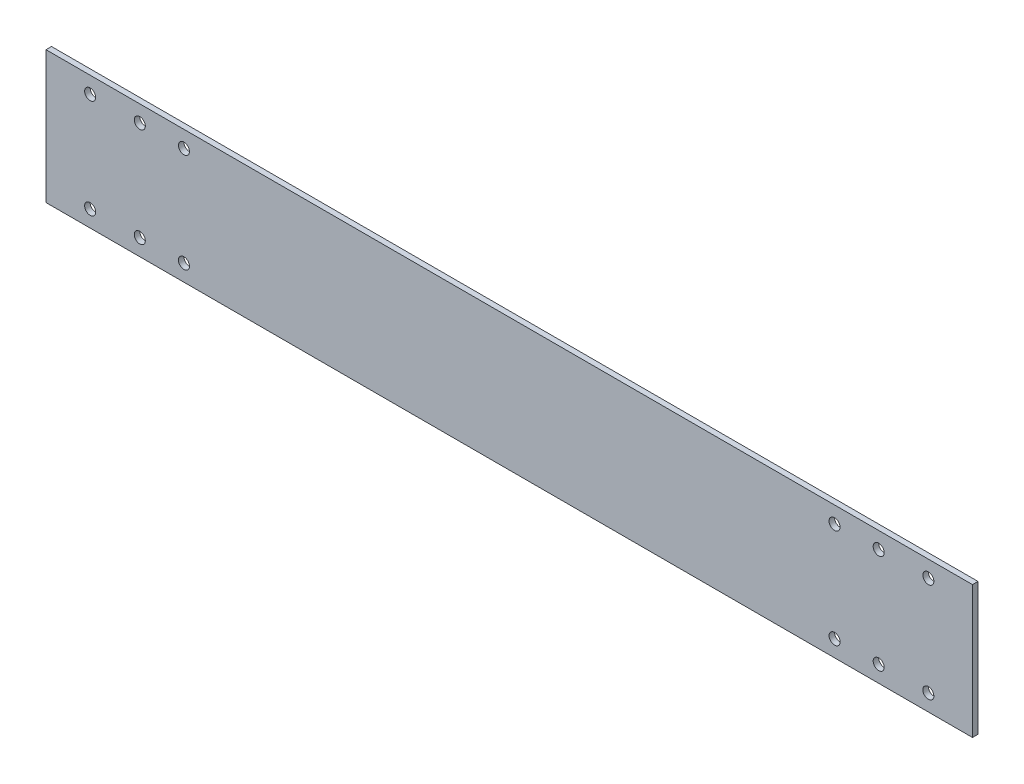
ISO-10303-21;
HEADER;
FILE_DESCRIPTION(('STEP AP214'),'2;1');
FILE_NAME('part.step','',(''),(''),'','','');
FILE_SCHEMA(('AUTOMOTIVE_DESIGN { 1 0 10303 214 1 1 1 1 }'));
ENDSEC;
DATA;
#1=APPLICATION_CONTEXT('core data for automotive mechanical design processes');
#2=APPLICATION_PROTOCOL_DEFINITION('international standard','automotive_design',2000,#1);
#3=PRODUCT_CONTEXT('',#1,'mechanical');
#4=PRODUCT('Part','Part','',(#3));
#5=PRODUCT_RELATED_PRODUCT_CATEGORY('part','',(#4));
#6=PRODUCT_DEFINITION_FORMATION('','',#4);
#7=PRODUCT_DEFINITION_CONTEXT('part definition',#1,'design');
#8=PRODUCT_DEFINITION('design','',#6,#7);
#9=PRODUCT_DEFINITION_SHAPE('','',#8);
#10=(LENGTH_UNIT() NAMED_UNIT(*) SI_UNIT(.MILLI.,.METRE.));
#11=(NAMED_UNIT(*) PLANE_ANGLE_UNIT() SI_UNIT($,.RADIAN.));
#12=(NAMED_UNIT(*) SI_UNIT($,.STERADIAN.) SOLID_ANGLE_UNIT());
#13=UNCERTAINTY_MEASURE_WITH_UNIT(LENGTH_MEASURE(1.E-05),#10,'distance_accuracy_value','');
#14=(GEOMETRIC_REPRESENTATION_CONTEXT(3) GLOBAL_UNCERTAINTY_ASSIGNED_CONTEXT((#13)) GLOBAL_UNIT_ASSIGNED_CONTEXT((#10,
#11,#12)) REPRESENTATION_CONTEXT('',''));
#15=CARTESIAN_POINT('',(0.,0.,0.));
#16=DIRECTION('',(0.,0.,1.));
#17=DIRECTION('',(1.,0.,0.));
#18=AXIS2_PLACEMENT_3D('',#15,#16,#17);
#19=CARTESIAN_POINT('',(-247.204603891019,6281.90722402998,3.17499999999996));
#20=DIRECTION('',(1.,0.,0.));
#21=DIRECTION('',(0.,0.,-1.));
#22=AXIS2_PLACEMENT_3D('',#19,#20,#21);
#23=PLANE('',#22);
#24=DIRECTION('',(0.,-1.,0.));
#25=VECTOR('',#24,1.);
#26=CARTESIAN_POINT('',(-247.204603891019,6281.90722402998,0.));
#27=LINE('',#26,#25);
#28=CARTESIAN_POINT('',(-247.204603891019,6281.90722402998,0.));
#29=VERTEX_POINT('',#28);
#30=CARTESIAN_POINT('',(-247.204603891019,6205.70722402998,0.));
#31=VERTEX_POINT('',#30);
#32=EDGE_CURVE('E97',#29,#31,#27,.T.);
#33=ORIENTED_EDGE('',*,*,#32,.T.);
#34=DIRECTION('',(0.,0.,-1.));
#35=VECTOR('',#34,1.);
#36=CARTESIAN_POINT('',(-247.204603891019,6205.70722402998,3.17499999999996));
#37=LINE('',#36,#35);
#38=CARTESIAN_POINT('',(-247.204603891019,6205.70722402998,3.17499999999996));
#39=VERTEX_POINT('',#38);
#40=EDGE_CURVE('E11',#39,#31,#37,.T.);
#41=ORIENTED_EDGE('',*,*,#40,.F.);
#42=DIRECTION('',(0.,-1.,0.));
#43=VECTOR('',#42,1.);
#44=CARTESIAN_POINT('',(-247.204603891019,6281.90722402998,3.17499999999996));
#45=LINE('',#44,#43);
#46=CARTESIAN_POINT('',(-247.204603891019,6281.90722402998,3.17499999999996));
#47=VERTEX_POINT('',#46);
#48=EDGE_CURVE('E85',#47,#39,#45,.T.);
#49=ORIENTED_EDGE('',*,*,#48,.F.);
#50=DIRECTION('',(0.,0.,-1.));
#51=VECTOR('',#50,1.);
#52=CARTESIAN_POINT('',(-247.204603891019,6281.90722402998,3.17499999999996));
#53=LINE('',#52,#51);
#54=EDGE_CURVE('E93',#47,#29,#53,.T.);
#55=ORIENTED_EDGE('',*,*,#54,.T.);
#56=EDGE_LOOP('',(#33,#41,#49,#55));
#57=FACE_BOUND('',#56,.T.);
#58=ADVANCED_FACE('F34',(#57),#23,.F.);
#59=CARTESIAN_POINT('',(-247.204603891019,6205.70722402998,3.17499999999996));
#60=DIRECTION('',(0.,1.,0.));
#61=DIRECTION('',(0.,0.,1.));
#62=AXIS2_PLACEMENT_3D('',#59,#60,#61);
#63=PLANE('',#62);
#64=DIRECTION('',(1.,0.,0.));
#65=VECTOR('',#64,1.);
#66=CARTESIAN_POINT('',(-247.204603891019,6205.70722402998,0.));
#67=LINE('',#66,#65);
#68=CARTESIAN_POINT('',(285.941396108981,6205.70722402998,0.));
#69=VERTEX_POINT('',#68);
#70=EDGE_CURVE('E89',#31,#69,#67,.T.);
#71=ORIENTED_EDGE('',*,*,#70,.T.);
#72=DIRECTION('',(0.,0.,-1.));
#73=VECTOR('',#72,1.);
#74=CARTESIAN_POINT('',(285.941396108981,6205.70722402998,3.17499999999996));
#75=LINE('',#74,#73);
#76=CARTESIAN_POINT('',(285.941396108981,6205.70722402998,3.17499999999996));
#77=VERTEX_POINT('',#76);
#78=EDGE_CURVE('E42',#77,#69,#75,.T.);
#79=ORIENTED_EDGE('',*,*,#78,.F.);
#80=DIRECTION('',(1.,0.,0.));
#81=VECTOR('',#80,1.);
#82=CARTESIAN_POINT('',(-247.204603891019,6205.70722402998,3.17499999999996));
#83=LINE('',#82,#81);
#84=EDGE_CURVE('E80',#39,#77,#83,.T.);
#85=ORIENTED_EDGE('',*,*,#84,.F.);
#86=ORIENTED_EDGE('',*,*,#40,.T.);
#87=EDGE_LOOP('',(#71,#79,#85,#86));
#88=FACE_BOUND('',#87,.T.);
#89=ADVANCED_FACE('F88',(#88),#63,.F.);
#90=CARTESIAN_POINT('',(285.941396108981,6281.90722402998,3.17499999999996));
#91=DIRECTION('',(-1.,0.,0.));
#92=DIRECTION('',(0.,0.,1.));
#93=AXIS2_PLACEMENT_3D('',#90,#91,#92);
#94=PLANE('',#93);
#95=DIRECTION('',(0.,1.,0.));
#96=VECTOR('',#95,1.);
#97=CARTESIAN_POINT('',(285.941396108981,6281.90722402998,0.));
#98=LINE('',#97,#96);
#99=CARTESIAN_POINT('',(285.941396108981,6281.90722402998,0.));
#100=VERTEX_POINT('',#99);
#101=EDGE_CURVE('E67',#69,#100,#98,.T.);
#102=ORIENTED_EDGE('',*,*,#101,.T.);
#103=DIRECTION('',(0.,0.,-1.));
#104=VECTOR('',#103,1.);
#105=CARTESIAN_POINT('',(285.941396108981,6281.90722402998,3.17499999999996));
#106=LINE('',#105,#104);
#107=CARTESIAN_POINT('',(285.941396108981,6281.90722402998,3.17499999999996));
#108=VERTEX_POINT('',#107);
#109=EDGE_CURVE('E90',#108,#100,#106,.T.);
#110=ORIENTED_EDGE('',*,*,#109,.F.);
#111=DIRECTION('',(0.,1.,0.));
#112=VECTOR('',#111,1.);
#113=CARTESIAN_POINT('',(285.941396108981,6281.90722402998,3.17499999999996));
#114=LINE('',#113,#112);
#115=EDGE_CURVE('E83',#77,#108,#114,.T.);
#116=ORIENTED_EDGE('',*,*,#115,.F.);
#117=ORIENTED_EDGE('',*,*,#78,.T.);
#118=EDGE_LOOP('',(#102,#110,#116,#117));
#119=FACE_BOUND('',#118,.T.);
#120=ADVANCED_FACE('F91',(#119),#94,.F.);
#121=CARTESIAN_POINT('',(-247.204603891019,6281.90722402998,3.17499999999996));
#122=DIRECTION('',(0.,-1.,0.));
#123=DIRECTION('',(0.,0.,-1.));
#124=AXIS2_PLACEMENT_3D('',#121,#122,#123);
#125=PLANE('',#124);
#126=DIRECTION('',(-1.,0.,0.));
#127=VECTOR('',#126,1.);
#128=CARTESIAN_POINT('',(-247.204603891019,6281.90722402998,0.));
#129=LINE('',#128,#127);
#130=EDGE_CURVE('E73',#100,#29,#129,.T.);
#131=ORIENTED_EDGE('',*,*,#130,.T.);
#132=ORIENTED_EDGE('',*,*,#54,.F.);
#133=DIRECTION('',(-1.,0.,0.));
#134=VECTOR('',#133,1.);
#135=CARTESIAN_POINT('',(-247.204603891019,6281.90722402998,3.17499999999996));
#136=LINE('',#135,#134);
#137=EDGE_CURVE('E50',#108,#47,#136,.T.);
#138=ORIENTED_EDGE('',*,*,#137,.F.);
#139=ORIENTED_EDGE('',*,*,#109,.T.);
#140=EDGE_LOOP('',(#131,#132,#138,#139));
#141=FACE_BOUND('',#140,.T.);
#142=ADVANCED_FACE('F105',(#141),#125,.F.);
#143=CARTESIAN_POINT('',(0.,0.,3.17499999999996));
#144=DIRECTION('',(0.,0.,1.));
#145=DIRECTION('',(1.,0.,0.));
#146=AXIS2_PLACEMENT_3D('',#143,#144,#145);
#147=PLANE('',#146);
#148=CARTESIAN_POINT('',(231.966396108981,6215.23222402998,3.17499999999996));
#149=DIRECTION('',(0.,0.,-1.));
#150=DIRECTION('',(-1.,0.,0.));
#151=AXIS2_PLACEMENT_3D('',#148,#149,#150);
#152=CIRCLE('',#151,3.17500000000001);
#153=CARTESIAN_POINT('',(228.791396108981,6215.23222402998,3.17499999999996));
#154=VERTEX_POINT('',#153);
#155=EDGE_CURVE('E176',#154,#154,#152,.T.);
#156=ORIENTED_EDGE('',*,*,#155,.T.);
#157=EDGE_LOOP('',(#156));
#158=FACE_BOUND('',#157,.T.);
#159=CARTESIAN_POINT('',(206.566396108981,6215.23222402998,3.17499999999996));
#160=DIRECTION('',(0.,0.,-1.));
#161=DIRECTION('',(-1.,0.,0.));
#162=AXIS2_PLACEMENT_3D('',#159,#160,#161);
#163=CIRCLE('',#162,3.17500000000001);
#164=CARTESIAN_POINT('',(203.391396108981,6215.23222402998,3.17499999999996));
#165=VERTEX_POINT('',#164);
#166=EDGE_CURVE('E170',#165,#165,#163,.T.);
#167=ORIENTED_EDGE('',*,*,#166,.T.);
#168=EDGE_LOOP('',(#167));
#169=FACE_BOUND('',#168,.T.);
#170=CARTESIAN_POINT('',(206.566396108981,6272.38222402998,3.17499999999996));
#171=DIRECTION('',(0.,0.,-1.));
#172=DIRECTION('',(-1.,0.,0.));
#173=AXIS2_PLACEMENT_3D('',#170,#171,#172);
#174=CIRCLE('',#173,3.17500000000001);
#175=CARTESIAN_POINT('',(203.391396108981,6272.38222402998,3.17499999999996));
#176=VERTEX_POINT('',#175);
#177=EDGE_CURVE('E164',#176,#176,#174,.T.);
#178=ORIENTED_EDGE('',*,*,#177,.T.);
#179=EDGE_LOOP('',(#178));
#180=FACE_BOUND('',#179,.T.);
#181=CARTESIAN_POINT('',(231.966396108981,6272.38222402998,3.17499999999996));
#182=DIRECTION('',(0.,0.,-1.));
#183=DIRECTION('',(-1.,0.,0.));
#184=AXIS2_PLACEMENT_3D('',#181,#182,#183);
#185=CIRCLE('',#184,3.17500000000001);
#186=CARTESIAN_POINT('',(228.791396108981,6272.38222402998,3.17499999999996));
#187=VERTEX_POINT('',#186);
#188=EDGE_CURVE('E158',#187,#187,#185,.T.);
#189=ORIENTED_EDGE('',*,*,#188,.T.);
#190=EDGE_LOOP('',(#189));
#191=FACE_BOUND('',#190,.T.);
#192=CARTESIAN_POINT('',(260.541396108981,6215.23222402998,3.17499999999996));
#193=DIRECTION('',(0.,0.,-1.));
#194=DIRECTION('',(-1.,0.,0.));
#195=AXIS2_PLACEMENT_3D('',#192,#193,#194);
#196=CIRCLE('',#195,3.17499999999998);
#197=CARTESIAN_POINT('',(257.366396108981,6215.23222402998,3.17499999999996));
#198=VERTEX_POINT('',#197);
#199=EDGE_CURVE('E152',#198,#198,#196,.T.);
#200=ORIENTED_EDGE('',*,*,#199,.T.);
#201=EDGE_LOOP('',(#200));
#202=FACE_BOUND('',#201,.T.);
#203=CARTESIAN_POINT('',(260.541396108981,6272.38222402998,3.17499999999996));
#204=DIRECTION('',(0.,0.,-1.));
#205=DIRECTION('',(-1.,0.,0.));
#206=AXIS2_PLACEMENT_3D('',#203,#204,#205);
#207=CIRCLE('',#206,3.17499999999998);
#208=CARTESIAN_POINT('',(257.366396108981,6272.38222402998,3.17499999999996));
#209=VERTEX_POINT('',#208);
#210=EDGE_CURVE('E146',#209,#209,#207,.T.);
#211=ORIENTED_EDGE('',*,*,#210,.T.);
#212=EDGE_LOOP('',(#211));
#213=FACE_BOUND('',#212,.T.);
#214=CARTESIAN_POINT('',(-221.804603891019,6272.38222402998,3.17499999999996));
#215=DIRECTION('',(0.,0.,-1.));
#216=DIRECTION('',(-1.,0.,0.));
#217=AXIS2_PLACEMENT_3D('',#214,#215,#216);
#218=CIRCLE('',#217,3.17500000000001);
#219=CARTESIAN_POINT('',(-224.979603891019,6272.38222402998,3.17499999999996));
#220=VERTEX_POINT('',#219);
#221=EDGE_CURVE('E140',#220,#220,#218,.T.);
#222=ORIENTED_EDGE('',*,*,#221,.T.);
#223=EDGE_LOOP('',(#222));
#224=FACE_BOUND('',#223,.T.);
#225=CARTESIAN_POINT('',(-221.804603891019,6215.23222402998,3.17499999999996));
#226=DIRECTION('',(0.,0.,-1.));
#227=DIRECTION('',(-1.,0.,0.));
#228=AXIS2_PLACEMENT_3D('',#225,#226,#227);
#229=CIRCLE('',#228,3.17500000000001);
#230=CARTESIAN_POINT('',(-224.979603891019,6215.23222402998,3.17499999999996));
#231=VERTEX_POINT('',#230);
#232=EDGE_CURVE('E134',#231,#231,#229,.T.);
#233=ORIENTED_EDGE('',*,*,#232,.T.);
#234=EDGE_LOOP('',(#233));
#235=FACE_BOUND('',#234,.T.);
#236=CARTESIAN_POINT('',(-193.229603891019,6272.38222402998,3.17499999999996));
#237=DIRECTION('',(0.,0.,-1.));
#238=DIRECTION('',(-1.,0.,0.));
#239=AXIS2_PLACEMENT_3D('',#236,#237,#238);
#240=CIRCLE('',#239,3.17500000000001);
#241=CARTESIAN_POINT('',(-196.404603891019,6272.38222402998,3.17499999999996));
#242=VERTEX_POINT('',#241);
#243=EDGE_CURVE('E128',#242,#242,#240,.T.);
#244=ORIENTED_EDGE('',*,*,#243,.T.);
#245=EDGE_LOOP('',(#244));
#246=FACE_BOUND('',#245,.T.);
#247=CARTESIAN_POINT('',(-167.829603891019,6272.38222402998,3.17499999999996));
#248=DIRECTION('',(0.,0.,-1.));
#249=DIRECTION('',(-1.,0.,0.));
#250=AXIS2_PLACEMENT_3D('',#247,#248,#249);
#251=CIRCLE('',#250,3.17500000000001);
#252=CARTESIAN_POINT('',(-171.004603891019,6272.38222402998,3.17499999999996));
#253=VERTEX_POINT('',#252);
#254=EDGE_CURVE('E122',#253,#253,#251,.T.);
#255=ORIENTED_EDGE('',*,*,#254,.T.);
#256=EDGE_LOOP('',(#255));
#257=FACE_BOUND('',#256,.T.);
#258=CARTESIAN_POINT('',(-167.829603891019,6215.23222402998,3.17499999999996));
#259=DIRECTION('',(0.,0.,-1.));
#260=DIRECTION('',(-1.,0.,0.));
#261=AXIS2_PLACEMENT_3D('',#258,#259,#260);
#262=CIRCLE('',#261,3.17500000000001);
#263=CARTESIAN_POINT('',(-171.004603891019,6215.23222402998,3.17499999999996));
#264=VERTEX_POINT('',#263);
#265=EDGE_CURVE('E116',#264,#264,#262,.T.);
#266=ORIENTED_EDGE('',*,*,#265,.T.);
#267=EDGE_LOOP('',(#266));
#268=FACE_BOUND('',#267,.T.);
#269=CARTESIAN_POINT('',(-193.229603891019,6215.23222402998,3.17499999999996));
#270=DIRECTION('',(0.,0.,-1.));
#271=DIRECTION('',(-1.,0.,0.));
#272=AXIS2_PLACEMENT_3D('',#269,#270,#271);
#273=CIRCLE('',#272,3.17500000000001);
#274=CARTESIAN_POINT('',(-196.404603891019,6215.23222402998,3.17499999999996));
#275=VERTEX_POINT('',#274);
#276=EDGE_CURVE('E100',#275,#275,#273,.T.);
#277=ORIENTED_EDGE('',*,*,#276,.T.);
#278=EDGE_LOOP('',(#277));
#279=FACE_BOUND('',#278,.T.);
#280=ORIENTED_EDGE('',*,*,#48,.T.);
#281=ORIENTED_EDGE('',*,*,#84,.T.);
#282=ORIENTED_EDGE('',*,*,#115,.T.);
#283=ORIENTED_EDGE('',*,*,#137,.T.);
#284=EDGE_LOOP('',(#280,#281,#282,#283));
#285=FACE_BOUND('',#284,.T.);
#286=ADVANCED_FACE('F81',(#158,#169,#180,#191,#202,#213,#224,#235,#246,#257,#268,#279,#285),
#147,.T.);
#287=CARTESIAN_POINT('',(0.,0.,0.));
#288=DIRECTION('',(0.,0.,1.));
#289=DIRECTION('',(1.,0.,0.));
#290=AXIS2_PLACEMENT_3D('',#287,#288,#289);
#291=PLANE('',#290);
#292=CARTESIAN_POINT('',(231.966396108981,6215.23222402998,0.));
#293=DIRECTION('',(0.,0.,-1.));
#294=DIRECTION('',(-1.,0.,0.));
#295=AXIS2_PLACEMENT_3D('',#292,#293,#294);
#296=CIRCLE('',#295,3.17499999999998);
#297=CARTESIAN_POINT('',(228.791396108981,6215.23222402998,0.));
#298=VERTEX_POINT('',#297);
#299=EDGE_CURVE('E179',#298,#298,#296,.T.);
#300=ORIENTED_EDGE('',*,*,#299,.F.);
#301=EDGE_LOOP('',(#300));
#302=FACE_BOUND('',#301,.T.);
#303=CARTESIAN_POINT('',(206.566396108981,6215.23222402998,0.));
#304=DIRECTION('',(0.,0.,-1.));
#305=DIRECTION('',(-1.,0.,0.));
#306=AXIS2_PLACEMENT_3D('',#303,#304,#305);
#307=CIRCLE('',#306,3.17499999999998);
#308=CARTESIAN_POINT('',(203.391396108981,6215.23222402998,0.));
#309=VERTEX_POINT('',#308);
#310=EDGE_CURVE('E173',#309,#309,#307,.T.);
#311=ORIENTED_EDGE('',*,*,#310,.F.);
#312=EDGE_LOOP('',(#311));
#313=FACE_BOUND('',#312,.T.);
#314=CARTESIAN_POINT('',(206.566396108981,6272.38222402998,0.));
#315=DIRECTION('',(0.,0.,-1.));
#316=DIRECTION('',(-1.,0.,0.));
#317=AXIS2_PLACEMENT_3D('',#314,#315,#316);
#318=CIRCLE('',#317,3.17499999999998);
#319=CARTESIAN_POINT('',(203.391396108981,6272.38222402998,0.));
#320=VERTEX_POINT('',#319);
#321=EDGE_CURVE('E167',#320,#320,#318,.T.);
#322=ORIENTED_EDGE('',*,*,#321,.F.);
#323=EDGE_LOOP('',(#322));
#324=FACE_BOUND('',#323,.T.);
#325=CARTESIAN_POINT('',(231.966396108981,6272.38222402998,0.));
#326=DIRECTION('',(0.,0.,-1.));
#327=DIRECTION('',(-1.,0.,0.));
#328=AXIS2_PLACEMENT_3D('',#325,#326,#327);
#329=CIRCLE('',#328,3.17499999999998);
#330=CARTESIAN_POINT('',(228.791396108981,6272.38222402998,0.));
#331=VERTEX_POINT('',#330);
#332=EDGE_CURVE('E161',#331,#331,#329,.T.);
#333=ORIENTED_EDGE('',*,*,#332,.F.);
#334=EDGE_LOOP('',(#333));
#335=FACE_BOUND('',#334,.T.);
#336=CARTESIAN_POINT('',(260.541396108981,6215.23222402998,0.));
#337=DIRECTION('',(0.,0.,-1.));
#338=DIRECTION('',(-1.,0.,0.));
#339=AXIS2_PLACEMENT_3D('',#336,#337,#338);
#340=CIRCLE('',#339,3.17499999999998);
#341=CARTESIAN_POINT('',(257.366396108981,6215.23222402998,0.));
#342=VERTEX_POINT('',#341);
#343=EDGE_CURVE('E155',#342,#342,#340,.T.);
#344=ORIENTED_EDGE('',*,*,#343,.F.);
#345=EDGE_LOOP('',(#344));
#346=FACE_BOUND('',#345,.T.);
#347=CARTESIAN_POINT('',(260.541396108981,6272.38222402998,0.));
#348=DIRECTION('',(0.,0.,-1.));
#349=DIRECTION('',(-1.,0.,0.));
#350=AXIS2_PLACEMENT_3D('',#347,#348,#349);
#351=CIRCLE('',#350,3.17499999999998);
#352=CARTESIAN_POINT('',(257.366396108981,6272.38222402998,0.));
#353=VERTEX_POINT('',#352);
#354=EDGE_CURVE('E149',#353,#353,#351,.T.);
#355=ORIENTED_EDGE('',*,*,#354,.F.);
#356=EDGE_LOOP('',(#355));
#357=FACE_BOUND('',#356,.T.);
#358=CARTESIAN_POINT('',(-221.804603891019,6272.38222402998,0.));
#359=DIRECTION('',(0.,0.,-1.));
#360=DIRECTION('',(-1.,0.,0.));
#361=AXIS2_PLACEMENT_3D('',#358,#359,#360);
#362=CIRCLE('',#361,3.17499999999998);
#363=CARTESIAN_POINT('',(-224.979603891019,6272.38222402998,0.));
#364=VERTEX_POINT('',#363);
#365=EDGE_CURVE('E143',#364,#364,#362,.T.);
#366=ORIENTED_EDGE('',*,*,#365,.F.);
#367=EDGE_LOOP('',(#366));
#368=FACE_BOUND('',#367,.T.);
#369=CARTESIAN_POINT('',(-221.804603891019,6215.23222402998,0.));
#370=DIRECTION('',(0.,0.,-1.));
#371=DIRECTION('',(-1.,0.,0.));
#372=AXIS2_PLACEMENT_3D('',#369,#370,#371);
#373=CIRCLE('',#372,3.17499999999998);
#374=CARTESIAN_POINT('',(-224.979603891019,6215.23222402998,0.));
#375=VERTEX_POINT('',#374);
#376=EDGE_CURVE('E137',#375,#375,#373,.T.);
#377=ORIENTED_EDGE('',*,*,#376,.F.);
#378=EDGE_LOOP('',(#377));
#379=FACE_BOUND('',#378,.T.);
#380=CARTESIAN_POINT('',(-193.229603891019,6272.38222402998,0.));
#381=DIRECTION('',(0.,0.,-1.));
#382=DIRECTION('',(-1.,0.,0.));
#383=AXIS2_PLACEMENT_3D('',#380,#381,#382);
#384=CIRCLE('',#383,3.17499999999998);
#385=CARTESIAN_POINT('',(-196.404603891019,6272.38222402998,0.));
#386=VERTEX_POINT('',#385);
#387=EDGE_CURVE('E131',#386,#386,#384,.T.);
#388=ORIENTED_EDGE('',*,*,#387,.F.);
#389=EDGE_LOOP('',(#388));
#390=FACE_BOUND('',#389,.T.);
#391=CARTESIAN_POINT('',(-167.829603891019,6272.38222402998,0.));
#392=DIRECTION('',(0.,0.,-1.));
#393=DIRECTION('',(-1.,0.,0.));
#394=AXIS2_PLACEMENT_3D('',#391,#392,#393);
#395=CIRCLE('',#394,3.17499999999998);
#396=CARTESIAN_POINT('',(-171.004603891019,6272.38222402998,0.));
#397=VERTEX_POINT('',#396);
#398=EDGE_CURVE('E125',#397,#397,#395,.T.);
#399=ORIENTED_EDGE('',*,*,#398,.F.);
#400=EDGE_LOOP('',(#399));
#401=FACE_BOUND('',#400,.T.);
#402=CARTESIAN_POINT('',(-167.829603891019,6215.23222402998,0.));
#403=DIRECTION('',(0.,0.,-1.));
#404=DIRECTION('',(-1.,0.,0.));
#405=AXIS2_PLACEMENT_3D('',#402,#403,#404);
#406=CIRCLE('',#405,3.17499999999998);
#407=CARTESIAN_POINT('',(-171.004603891019,6215.23222402998,0.));
#408=VERTEX_POINT('',#407);
#409=EDGE_CURVE('E119',#408,#408,#406,.T.);
#410=ORIENTED_EDGE('',*,*,#409,.F.);
#411=EDGE_LOOP('',(#410));
#412=FACE_BOUND('',#411,.T.);
#413=CARTESIAN_POINT('',(-193.229603891019,6215.23222402998,0.));
#414=DIRECTION('',(0.,0.,-1.));
#415=DIRECTION('',(-1.,0.,0.));
#416=AXIS2_PLACEMENT_3D('',#413,#414,#415);
#417=CIRCLE('',#416,3.17499999999998);
#418=CARTESIAN_POINT('',(-196.404603891019,6215.23222402998,0.));
#419=VERTEX_POINT('',#418);
#420=EDGE_CURVE('E113',#419,#419,#417,.T.);
#421=ORIENTED_EDGE('',*,*,#420,.F.);
#422=EDGE_LOOP('',(#421));
#423=FACE_BOUND('',#422,.T.);
#424=ORIENTED_EDGE('',*,*,#32,.F.);
#425=ORIENTED_EDGE('',*,*,#130,.F.);
#426=ORIENTED_EDGE('',*,*,#101,.F.);
#427=ORIENTED_EDGE('',*,*,#70,.F.);
#428=EDGE_LOOP('',(#424,#425,#426,#427));
#429=FACE_BOUND('',#428,.T.);
#430=ADVANCED_FACE('F108',(#302,#313,#324,#335,#346,#357,#368,#379,#390,#401,#412,#423,#429),
#291,.F.);
#431=CARTESIAN_POINT('',(-193.229603891019,6215.23222402998,0.));
#432=DIRECTION('',(0.,0.,-1.));
#433=DIRECTION('',(-1.,0.,0.));
#434=AXIS2_PLACEMENT_3D('',#431,#432,#433);
#435=CYLINDRICAL_SURFACE('',#434,3.175);
#436=ORIENTED_EDGE('',*,*,#276,.F.);
#437=EDGE_LOOP('',(#436));
#438=FACE_BOUND('',#437,.T.);
#439=ORIENTED_EDGE('',*,*,#420,.T.);
#440=EDGE_LOOP('',(#439));
#441=FACE_BOUND('',#440,.T.);
#442=ADVANCED_FACE('F187',(#438,#441),#435,.F.);
#443=CARTESIAN_POINT('',(-167.829603891019,6215.23222402998,0.));
#444=DIRECTION('',(0.,0.,-1.));
#445=DIRECTION('',(-1.,0.,0.));
#446=AXIS2_PLACEMENT_3D('',#443,#444,#445);
#447=CYLINDRICAL_SURFACE('',#446,3.175);
#448=ORIENTED_EDGE('',*,*,#265,.F.);
#449=EDGE_LOOP('',(#448));
#450=FACE_BOUND('',#449,.T.);
#451=ORIENTED_EDGE('',*,*,#409,.T.);
#452=EDGE_LOOP('',(#451));
#453=FACE_BOUND('',#452,.T.);
#454=ADVANCED_FACE('F212',(#450,#453),#447,.F.);
#455=CARTESIAN_POINT('',(-167.829603891019,6272.38222402998,0.));
#456=DIRECTION('',(0.,0.,-1.));
#457=DIRECTION('',(-1.,0.,0.));
#458=AXIS2_PLACEMENT_3D('',#455,#456,#457);
#459=CYLINDRICAL_SURFACE('',#458,3.175);
#460=ORIENTED_EDGE('',*,*,#254,.F.);
#461=EDGE_LOOP('',(#460));
#462=FACE_BOUND('',#461,.T.);
#463=ORIENTED_EDGE('',*,*,#398,.T.);
#464=EDGE_LOOP('',(#463));
#465=FACE_BOUND('',#464,.T.);
#466=ADVANCED_FACE('F218',(#462,#465),#459,.F.);
#467=CARTESIAN_POINT('',(-193.229603891019,6272.38222402998,0.));
#468=DIRECTION('',(0.,0.,-1.));
#469=DIRECTION('',(-1.,0.,0.));
#470=AXIS2_PLACEMENT_3D('',#467,#468,#469);
#471=CYLINDRICAL_SURFACE('',#470,3.175);
#472=ORIENTED_EDGE('',*,*,#243,.F.);
#473=EDGE_LOOP('',(#472));
#474=FACE_BOUND('',#473,.T.);
#475=ORIENTED_EDGE('',*,*,#387,.T.);
#476=EDGE_LOOP('',(#475));
#477=FACE_BOUND('',#476,.T.);
#478=ADVANCED_FACE('F263',(#474,#477),#471,.F.);
#479=CARTESIAN_POINT('',(-221.804603891019,6215.23222402998,0.));
#480=DIRECTION('',(0.,0.,-1.));
#481=DIRECTION('',(-1.,0.,0.));
#482=AXIS2_PLACEMENT_3D('',#479,#480,#481);
#483=CYLINDRICAL_SURFACE('',#482,3.175);
#484=ORIENTED_EDGE('',*,*,#232,.F.);
#485=EDGE_LOOP('',(#484));
#486=FACE_BOUND('',#485,.T.);
#487=ORIENTED_EDGE('',*,*,#376,.T.);
#488=EDGE_LOOP('',(#487));
#489=FACE_BOUND('',#488,.T.);
#490=ADVANCED_FACE('F268',(#486,#489),#483,.F.);
#491=CARTESIAN_POINT('',(-221.804603891019,6272.38222402998,0.));
#492=DIRECTION('',(0.,0.,-1.));
#493=DIRECTION('',(-1.,0.,0.));
#494=AXIS2_PLACEMENT_3D('',#491,#492,#493);
#495=CYLINDRICAL_SURFACE('',#494,3.175);
#496=ORIENTED_EDGE('',*,*,#221,.F.);
#497=EDGE_LOOP('',(#496));
#498=FACE_BOUND('',#497,.T.);
#499=ORIENTED_EDGE('',*,*,#365,.T.);
#500=EDGE_LOOP('',(#499));
#501=FACE_BOUND('',#500,.T.);
#502=ADVANCED_FACE('F274',(#498,#501),#495,.F.);
#503=CARTESIAN_POINT('',(260.541396108981,6272.38222402998,0.));
#504=DIRECTION('',(0.,0.,-1.));
#505=DIRECTION('',(-1.,0.,0.));
#506=AXIS2_PLACEMENT_3D('',#503,#504,#505);
#507=CYLINDRICAL_SURFACE('',#506,3.17499999999998);
#508=ORIENTED_EDGE('',*,*,#210,.F.);
#509=EDGE_LOOP('',(#508));
#510=FACE_BOUND('',#509,.T.);
#511=ORIENTED_EDGE('',*,*,#354,.T.);
#512=EDGE_LOOP('',(#511));
#513=FACE_BOUND('',#512,.T.);
#514=ADVANCED_FACE('F278',(#510,#513),#507,.F.);
#515=CARTESIAN_POINT('',(260.541396108981,6215.23222402998,0.));
#516=DIRECTION('',(0.,0.,-1.));
#517=DIRECTION('',(-1.,0.,0.));
#518=AXIS2_PLACEMENT_3D('',#515,#516,#517);
#519=CYLINDRICAL_SURFACE('',#518,3.17499999999998);
#520=ORIENTED_EDGE('',*,*,#199,.F.);
#521=EDGE_LOOP('',(#520));
#522=FACE_BOUND('',#521,.T.);
#523=ORIENTED_EDGE('',*,*,#343,.T.);
#524=EDGE_LOOP('',(#523));
#525=FACE_BOUND('',#524,.T.);
#526=ADVANCED_FACE('F282',(#522,#525),#519,.F.);
#527=CARTESIAN_POINT('',(231.966396108981,6272.38222402998,0.));
#528=DIRECTION('',(0.,0.,-1.));
#529=DIRECTION('',(-1.,0.,0.));
#530=AXIS2_PLACEMENT_3D('',#527,#528,#529);
#531=CYLINDRICAL_SURFACE('',#530,3.175);
#532=ORIENTED_EDGE('',*,*,#188,.F.);
#533=EDGE_LOOP('',(#532));
#534=FACE_BOUND('',#533,.T.);
#535=ORIENTED_EDGE('',*,*,#332,.T.);
#536=EDGE_LOOP('',(#535));
#537=FACE_BOUND('',#536,.T.);
#538=ADVANCED_FACE('F286',(#534,#537),#531,.F.);
#539=CARTESIAN_POINT('',(206.566396108981,6272.38222402998,0.));
#540=DIRECTION('',(0.,0.,-1.));
#541=DIRECTION('',(-1.,0.,0.));
#542=AXIS2_PLACEMENT_3D('',#539,#540,#541);
#543=CYLINDRICAL_SURFACE('',#542,3.175);
#544=ORIENTED_EDGE('',*,*,#177,.F.);
#545=EDGE_LOOP('',(#544));
#546=FACE_BOUND('',#545,.T.);
#547=ORIENTED_EDGE('',*,*,#321,.T.);
#548=EDGE_LOOP('',(#547));
#549=FACE_BOUND('',#548,.T.);
#550=ADVANCED_FACE('F290',(#546,#549),#543,.F.);
#551=CARTESIAN_POINT('',(206.566396108981,6215.23222402998,0.));
#552=DIRECTION('',(0.,0.,-1.));
#553=DIRECTION('',(-1.,0.,0.));
#554=AXIS2_PLACEMENT_3D('',#551,#552,#553);
#555=CYLINDRICAL_SURFACE('',#554,3.175);
#556=ORIENTED_EDGE('',*,*,#166,.F.);
#557=EDGE_LOOP('',(#556));
#558=FACE_BOUND('',#557,.T.);
#559=ORIENTED_EDGE('',*,*,#310,.T.);
#560=EDGE_LOOP('',(#559));
#561=FACE_BOUND('',#560,.T.);
#562=ADVANCED_FACE('F294',(#558,#561),#555,.F.);
#563=CARTESIAN_POINT('',(231.966396108981,6215.23222402998,0.));
#564=DIRECTION('',(0.,0.,-1.));
#565=DIRECTION('',(-1.,0.,0.));
#566=AXIS2_PLACEMENT_3D('',#563,#564,#565);
#567=CYLINDRICAL_SURFACE('',#566,3.175);
#568=ORIENTED_EDGE('',*,*,#155,.F.);
#569=EDGE_LOOP('',(#568));
#570=FACE_BOUND('',#569,.T.);
#571=ORIENTED_EDGE('',*,*,#299,.T.);
#572=EDGE_LOOP('',(#571));
#573=FACE_BOUND('',#572,.T.);
#574=ADVANCED_FACE('F183',(#570,#573),#567,.F.);
#575=CLOSED_SHELL('',(#58,#89,#120,#142,#286,#430,#442,#454,#466,#478,#490,#502,#514,#526,#538,
#550,#562,#574));
#576=MANIFOLD_SOLID_BREP('B2',#575);
#577=ADVANCED_BREP_SHAPE_REPRESENTATION('',(#18,#576),#14);
#578=SHAPE_DEFINITION_REPRESENTATION(#9,#577);
ENDSEC;
END-ISO-10303-21;
